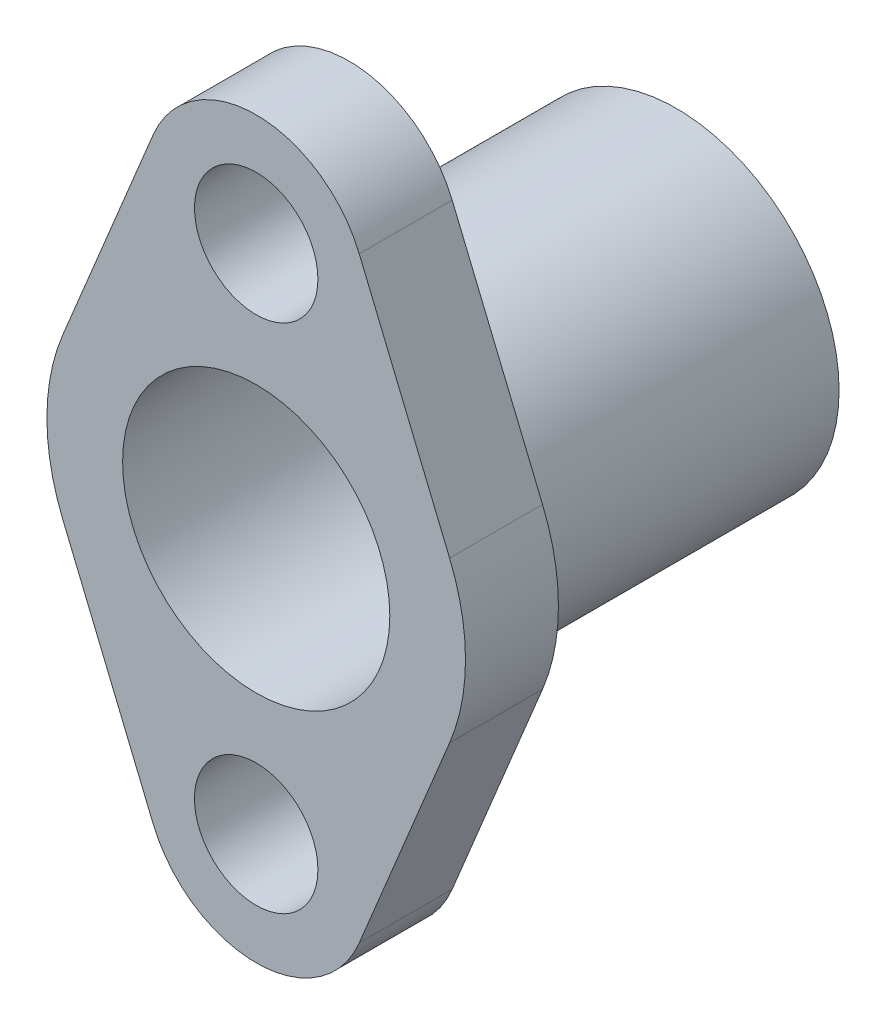
ISO-10303-21;
HEADER;
FILE_DESCRIPTION(('STEP AP214'),'2;1');
FILE_NAME('part.step','',(''),(''),'','','');
FILE_SCHEMA(('AUTOMOTIVE_DESIGN { 1 0 10303 214 1 1 1 1 }'));
ENDSEC;
DATA;
#1=APPLICATION_CONTEXT('core data for automotive mechanical design processes');
#2=APPLICATION_PROTOCOL_DEFINITION('international standard','automotive_design',2000,#1);
#3=PRODUCT_CONTEXT('',#1,'mechanical');
#4=PRODUCT('Part','Part','',(#3));
#5=PRODUCT_RELATED_PRODUCT_CATEGORY('part','',(#4));
#6=PRODUCT_DEFINITION_FORMATION('','',#4);
#7=PRODUCT_DEFINITION_CONTEXT('part definition',#1,'design');
#8=PRODUCT_DEFINITION('design','',#6,#7);
#9=PRODUCT_DEFINITION_SHAPE('','',#8);
#10=(LENGTH_UNIT() NAMED_UNIT(*) SI_UNIT(.MILLI.,.METRE.));
#11=(NAMED_UNIT(*) PLANE_ANGLE_UNIT() SI_UNIT($,.RADIAN.));
#12=(NAMED_UNIT(*) SI_UNIT($,.STERADIAN.) SOLID_ANGLE_UNIT());
#13=UNCERTAINTY_MEASURE_WITH_UNIT(LENGTH_MEASURE(1.E-05),#10,'distance_accuracy_value','');
#14=(GEOMETRIC_REPRESENTATION_CONTEXT(3) GLOBAL_UNCERTAINTY_ASSIGNED_CONTEXT((#13)) GLOBAL_UNIT_ASSIGNED_CONTEXT((#10,
#11,#12)) REPRESENTATION_CONTEXT('',''));
#15=CARTESIAN_POINT('',(0.,0.,0.));
#16=DIRECTION('',(0.,0.,1.));
#17=DIRECTION('',(1.,0.,0.));
#18=AXIS2_PLACEMENT_3D('',#15,#16,#17);
#19=CARTESIAN_POINT('',(0.,12.7,0.254000000000001));
#20=DIRECTION('',(0.,0.,1.));
#21=DIRECTION('',(1.,0.,0.));
#22=AXIS2_PLACEMENT_3D('',#19,#20,#21);
#23=PLANE('',#22);
#24=DIRECTION('',(0.382267441860465,-0.92405173171931,0.));
#25=VECTOR('',#24,1.);
#26=CARTESIAN_POINT('',(2.1209791632516,13.5774197927934,0.254000000000001));
#27=LINE('',#26,#25);
#28=CARTESIAN_POINT('',(3.52063709785057,10.1940389534884,0.254000000000001));
#29=VERTEX_POINT('',#28);
#30=CARTESIAN_POINT('',(6.60706228696624,2.73325043604651,0.254000000000001));
#31=VERTEX_POINT('',#30);
#32=EDGE_CURVE('E182',#29,#31,#27,.T.);
#33=ORIENTED_EDGE('',*,*,#32,.T.);
#34=CARTESIAN_POINT('',(0.,0.,0.254000000000001));
#35=DIRECTION('',(0.,0.,1.));
#36=DIRECTION('',(1.,0.,0.));
#37=AXIS2_PLACEMENT_3D('',#34,#35,#36);
#38=CIRCLE('',#37,7.1501);
#39=CARTESIAN_POINT('',(6.60706228696624,-2.73325043604651,0.254000000000001));
#40=VERTEX_POINT('',#39);
#41=EDGE_CURVE('E114',#31,#40,#38,.F.);
#42=ORIENTED_EDGE('',*,*,#41,.T.);
#43=DIRECTION('',(-0.382267441860465,-0.92405173171931,0.));
#44=VECTOR('',#43,1.);
#45=CARTESIAN_POINT('',(11.0931454106809,8.11091892070038,0.254000000000001));
#46=LINE('',#45,#44);
#47=CARTESIAN_POINT('',(3.52063709785057,-10.1940389534884,0.254000000000001));
#48=VERTEX_POINT('',#47);
#49=EDGE_CURVE('E117',#40,#48,#46,.T.);
#50=ORIENTED_EDGE('',*,*,#49,.T.);
#51=CARTESIAN_POINT('',(0.,-8.7376,0.254000000000001));
#52=DIRECTION('',(0.,0.,1.));
#53=DIRECTION('',(1.,0.,0.));
#54=AXIS2_PLACEMENT_3D('',#51,#52,#53);
#55=CIRCLE('',#54,3.81);
#56=CARTESIAN_POINT('',(-3.52063709785057,-10.1940389534884,0.254000000000001));
#57=VERTEX_POINT('',#56);
#58=EDGE_CURVE('E167',#48,#57,#55,.F.);
#59=ORIENTED_EDGE('',*,*,#58,.T.);
#60=DIRECTION('',(-0.382267441860465,0.92405173171931,0.));
#61=VECTOR('',#60,1.);
#62=CARTESIAN_POINT('',(-11.0931454106809,8.11091892070038,0.254000000000001));
#63=LINE('',#62,#61);
#64=CARTESIAN_POINT('',(-6.60706228696624,-2.73325043604651,0.254000000000001));
#65=VERTEX_POINT('',#64);
#66=EDGE_CURVE('E170',#57,#65,#63,.T.);
#67=ORIENTED_EDGE('',*,*,#66,.T.);
#68=CARTESIAN_POINT('',(0.,0.,0.254000000000001));
#69=DIRECTION('',(0.,0.,1.));
#70=DIRECTION('',(1.,0.,0.));
#71=AXIS2_PLACEMENT_3D('',#68,#69,#70);
#72=CIRCLE('',#71,7.1501);
#73=CARTESIAN_POINT('',(-6.60706228696624,2.73325043604651,0.254000000000001));
#74=VERTEX_POINT('',#73);
#75=EDGE_CURVE('E173',#65,#74,#72,.F.);
#76=ORIENTED_EDGE('',*,*,#75,.T.);
#77=DIRECTION('',(0.382267441860465,0.92405173171931,0.));
#78=VECTOR('',#77,1.);
#79=CARTESIAN_POINT('',(-2.12097916325161,13.5774197927934,0.254000000000001));
#80=LINE('',#79,#78);
#81=CARTESIAN_POINT('',(-3.52063709785057,10.1940389534884,0.254000000000001));
#82=VERTEX_POINT('',#81);
#83=EDGE_CURVE('E176',#74,#82,#80,.T.);
#84=ORIENTED_EDGE('',*,*,#83,.T.);
#85=CARTESIAN_POINT('',(0.,8.7376,0.254000000000001));
#86=DIRECTION('',(0.,0.,1.));
#87=DIRECTION('',(1.,0.,0.));
#88=AXIS2_PLACEMENT_3D('',#85,#86,#87);
#89=CIRCLE('',#88,3.81);
#90=EDGE_CURVE('E179',#82,#29,#89,.F.);
#91=ORIENTED_EDGE('',*,*,#90,.T.);
#92=EDGE_LOOP('',(#33,#42,#50,#59,#67,#76,#84,#91));
#93=FACE_BOUND('',#92,.T.);
#94=CARTESIAN_POINT('',(0.,8.7376,0.254000000000001));
#95=DIRECTION('',(0.,0.,1.));
#96=DIRECTION('',(1.,0.,0.));
#97=AXIS2_PLACEMENT_3D('',#94,#95,#96);
#98=CIRCLE('',#97,2.1082);
#99=CARTESIAN_POINT('',(2.1082,8.7376,0.254000000000001));
#100=VERTEX_POINT('',#99);
#101=EDGE_CURVE('E194',#100,#100,#98,.F.);
#102=ORIENTED_EDGE('',*,*,#101,.F.);
#103=EDGE_LOOP('',(#102));
#104=FACE_BOUND('',#103,.T.);
#105=CARTESIAN_POINT('',(0.,0.,0.254000000000001));
#106=DIRECTION('',(0.,0.,1.));
#107=DIRECTION('',(1.,0.,0.));
#108=AXIS2_PLACEMENT_3D('',#105,#106,#107);
#109=CIRCLE('',#108,5.5626);
#110=CARTESIAN_POINT('',(5.5626,0.,0.254000000000001));
#111=VERTEX_POINT('',#110);
#112=EDGE_CURVE('E197',#111,#111,#109,.T.);
#113=ORIENTED_EDGE('',*,*,#112,.T.);
#114=EDGE_LOOP('',(#113));
#115=FACE_BOUND('',#114,.T.);
#116=CARTESIAN_POINT('',(0.,-8.7376,0.254000000000001));
#117=DIRECTION('',(0.,0.,1.));
#118=DIRECTION('',(1.,0.,0.));
#119=AXIS2_PLACEMENT_3D('',#116,#117,#118);
#120=CIRCLE('',#119,2.1082);
#121=CARTESIAN_POINT('',(2.1082,-8.7376,0.254000000000001));
#122=VERTEX_POINT('',#121);
#123=EDGE_CURVE('E188',#122,#122,#120,.F.);
#124=ORIENTED_EDGE('',*,*,#123,.F.);
#125=EDGE_LOOP('',(#124));
#126=FACE_BOUND('',#125,.T.);
#127=ADVANCED_FACE('F47',(#93,#104,#115,#126),#23,.F.);
#128=CARTESIAN_POINT('',(0.,4.56438,3.429));
#129=DIRECTION('',(0.,0.,-1.));
#130=DIRECTION('',(-1.,0.,0.));
#131=AXIS2_PLACEMENT_3D('',#128,#129,#130);
#132=PLANE('',#131);
#133=DIRECTION('',(0.382267441860465,0.92405173171931,0.));
#134=VECTOR('',#133,1.);
#135=CARTESIAN_POINT('',(3.52063709785057,-10.1940389534884,3.429));
#136=LINE('',#135,#134);
#137=CARTESIAN_POINT('',(3.52063709785057,-10.1940389534884,3.429));
#138=VERTEX_POINT('',#137);
#139=CARTESIAN_POINT('',(6.60706228696624,-2.73325043604651,3.429));
#140=VERTEX_POINT('',#139);
#141=EDGE_CURVE('E133',#138,#140,#136,.T.);
#142=ORIENTED_EDGE('',*,*,#141,.T.);
#143=CARTESIAN_POINT('',(0.,0.,3.429));
#144=DIRECTION('',(0.,0.,1.));
#145=DIRECTION('',(1.,0.,0.));
#146=AXIS2_PLACEMENT_3D('',#143,#144,#145);
#147=CIRCLE('',#146,7.1501);
#148=CARTESIAN_POINT('',(6.60706228696624,2.73325043604651,3.429));
#149=VERTEX_POINT('',#148);
#150=EDGE_CURVE('E69',#140,#149,#147,.T.);
#151=ORIENTED_EDGE('',*,*,#150,.T.);
#152=DIRECTION('',(-0.382267441860465,0.92405173171931,0.));
#153=VECTOR('',#152,1.);
#154=CARTESIAN_POINT('',(6.60706228696624,2.73325043604651,3.429));
#155=LINE('',#154,#153);
#156=CARTESIAN_POINT('',(3.52063709785057,10.1940389534884,3.429));
#157=VERTEX_POINT('',#156);
#158=EDGE_CURVE('E121',#149,#157,#155,.T.);
#159=ORIENTED_EDGE('',*,*,#158,.T.);
#160=CARTESIAN_POINT('',(0.,8.7376,3.429));
#161=DIRECTION('',(0.,0.,1.));
#162=DIRECTION('',(1.,0.,0.));
#163=AXIS2_PLACEMENT_3D('',#160,#161,#162);
#164=CIRCLE('',#163,3.81);
#165=CARTESIAN_POINT('',(-3.52063709785057,10.1940389534884,3.429));
#166=VERTEX_POINT('',#165);
#167=EDGE_CURVE('E127',#157,#166,#164,.T.);
#168=ORIENTED_EDGE('',*,*,#167,.T.);
#169=DIRECTION('',(-0.382267441860465,-0.92405173171931,0.));
#170=VECTOR('',#169,1.);
#171=CARTESIAN_POINT('',(-3.52063709785057,10.1940389534884,3.429));
#172=LINE('',#171,#170);
#173=CARTESIAN_POINT('',(-6.60706228696624,2.73325043604651,3.429));
#174=VERTEX_POINT('',#173);
#175=EDGE_CURVE('E137',#166,#174,#172,.T.);
#176=ORIENTED_EDGE('',*,*,#175,.T.);
#177=CARTESIAN_POINT('',(0.,0.,3.429));
#178=DIRECTION('',(0.,0.,1.));
#179=DIRECTION('',(1.,0.,0.));
#180=AXIS2_PLACEMENT_3D('',#177,#178,#179);
#181=CIRCLE('',#180,7.1501);
#182=CARTESIAN_POINT('',(-6.60706228696624,-2.73325043604651,3.429));
#183=VERTEX_POINT('',#182);
#184=EDGE_CURVE('E140',#174,#183,#181,.T.);
#185=ORIENTED_EDGE('',*,*,#184,.T.);
#186=DIRECTION('',(0.382267441860465,-0.92405173171931,0.));
#187=VECTOR('',#186,1.);
#188=CARTESIAN_POINT('',(-6.60706228696624,-2.73325043604651,3.429));
#189=LINE('',#188,#187);
#190=CARTESIAN_POINT('',(-3.52063709785057,-10.1940389534884,3.429));
#191=VERTEX_POINT('',#190);
#192=EDGE_CURVE('E143',#183,#191,#189,.T.);
#193=ORIENTED_EDGE('',*,*,#192,.T.);
#194=CARTESIAN_POINT('',(0.,-8.7376,3.429));
#195=DIRECTION('',(0.,0.,1.));
#196=DIRECTION('',(1.,0.,0.));
#197=AXIS2_PLACEMENT_3D('',#194,#195,#196);
#198=CIRCLE('',#197,3.81);
#199=EDGE_CURVE('E146',#191,#138,#198,.T.);
#200=ORIENTED_EDGE('',*,*,#199,.T.);
#201=EDGE_LOOP('',(#142,#151,#159,#168,#176,#185,#193,#200));
#202=FACE_BOUND('',#201,.T.);
#203=CARTESIAN_POINT('',(0.,8.7376,3.429));
#204=DIRECTION('',(0.,0.,1.));
#205=DIRECTION('',(1.,0.,0.));
#206=AXIS2_PLACEMENT_3D('',#203,#204,#205);
#207=CIRCLE('',#206,2.1082);
#208=CARTESIAN_POINT('',(2.1082,8.7376,3.429));
#209=VERTEX_POINT('',#208);
#210=EDGE_CURVE('E191',#209,#209,#207,.T.);
#211=ORIENTED_EDGE('',*,*,#210,.F.);
#212=EDGE_LOOP('',(#211));
#213=FACE_BOUND('',#212,.T.);
#214=CARTESIAN_POINT('',(0.,0.,3.429));
#215=DIRECTION('',(0.,0.,1.));
#216=DIRECTION('',(1.,0.,0.));
#217=AXIS2_PLACEMENT_3D('',#214,#215,#216);
#218=CIRCLE('',#217,4.56438);
#219=CARTESIAN_POINT('',(4.56438,0.,3.429));
#220=VERTEX_POINT('',#219);
#221=EDGE_CURVE('E14',#220,#220,#218,.T.);
#222=ORIENTED_EDGE('',*,*,#221,.F.);
#223=EDGE_LOOP('',(#222));
#224=FACE_BOUND('',#223,.T.);
#225=CARTESIAN_POINT('',(0.,-8.7376,3.429));
#226=DIRECTION('',(0.,0.,1.));
#227=DIRECTION('',(1.,0.,0.));
#228=AXIS2_PLACEMENT_3D('',#225,#226,#227);
#229=CIRCLE('',#228,2.1082);
#230=CARTESIAN_POINT('',(2.1082,-8.7376,3.429));
#231=VERTEX_POINT('',#230);
#232=EDGE_CURVE('E185',#231,#231,#229,.T.);
#233=ORIENTED_EDGE('',*,*,#232,.F.);
#234=EDGE_LOOP('',(#233));
#235=FACE_BOUND('',#234,.T.);
#236=ADVANCED_FACE('F130',(#202,#213,#224,#235),#132,.F.);
#237=CARTESIAN_POINT('',(0.,0.,-8.4718061233274));
#238=DIRECTION('',(0.,0.,1.));
#239=DIRECTION('',(1.,0.,0.));
#240=AXIS2_PLACEMENT_3D('',#237,#238,#239);
#241=CYLINDRICAL_SURFACE('',#240,4.56438);
#242=CARTESIAN_POINT('',(0.,0.,-9.72415775921604));
#243=DIRECTION('',(0.,0.,1.));
#244=DIRECTION('',(1.,0.,0.));
#245=AXIS2_PLACEMENT_3D('',#242,#243,#244);
#246=CIRCLE('',#245,4.56438);
#247=CARTESIAN_POINT('',(4.56438,0.,-9.72415775921604));
#248=VERTEX_POINT('',#247);
#249=EDGE_CURVE('E54',#248,#248,#246,.T.);
#250=ORIENTED_EDGE('',*,*,#249,.F.);
#251=EDGE_LOOP('',(#250));
#252=FACE_BOUND('',#251,.T.);
#253=ORIENTED_EDGE('',*,*,#221,.T.);
#254=EDGE_LOOP('',(#253));
#255=FACE_BOUND('',#254,.T.);
#256=ADVANCED_FACE('F213',(#252,#255),#241,.F.);
#257=CARTESIAN_POINT('',(0.,0.,-9.72415775921604));
#258=DIRECTION('',(0.,0.,1.));
#259=DIRECTION('',(1.,0.,0.));
#260=AXIS2_PLACEMENT_3D('',#257,#258,#259);
#261=CONICAL_SURFACE('',#260,4.56438,1.0471975511966);
#262=CARTESIAN_POINT('',(0.,0.,-9.906));
#263=DIRECTION('',(0.,0.,1.));
#264=DIRECTION('',(1.,0.,0.));
#265=AXIS2_PLACEMENT_3D('',#262,#263,#264);
#266=CIRCLE('',#265,4.24942);
#267=CARTESIAN_POINT('',(4.24942,0.,-9.906));
#268=VERTEX_POINT('',#267);
#269=EDGE_CURVE('E206',#268,#268,#266,.T.);
#270=ORIENTED_EDGE('',*,*,#269,.F.);
#271=EDGE_LOOP('',(#270));
#272=FACE_BOUND('',#271,.T.);
#273=ORIENTED_EDGE('',*,*,#249,.T.);
#274=EDGE_LOOP('',(#273));
#275=FACE_BOUND('',#274,.T.);
#276=ADVANCED_FACE('F211',(#272,#275),#261,.F.);
#277=CARTESIAN_POINT('',(0.,0.,-8.4718061233274));
#278=DIRECTION('',(0.,0.,1.));
#279=DIRECTION('',(1.,0.,0.));
#280=AXIS2_PLACEMENT_3D('',#277,#278,#279);
#281=CYLINDRICAL_SURFACE('',#280,4.24942);
#282=CARTESIAN_POINT('',(0.,0.,-10.922));
#283=DIRECTION('',(0.,0.,1.));
#284=DIRECTION('',(1.,0.,0.));
#285=AXIS2_PLACEMENT_3D('',#282,#283,#284);
#286=CIRCLE('',#285,4.24942);
#287=CARTESIAN_POINT('',(4.24942,0.,-10.922));
#288=VERTEX_POINT('',#287);
#289=EDGE_CURVE('E203',#288,#288,#286,.T.);
#290=ORIENTED_EDGE('',*,*,#289,.F.);
#291=EDGE_LOOP('',(#290));
#292=FACE_BOUND('',#291,.T.);
#293=ORIENTED_EDGE('',*,*,#269,.T.);
#294=EDGE_LOOP('',(#293));
#295=FACE_BOUND('',#294,.T.);
#296=ADVANCED_FACE('F248',(#292,#295),#281,.F.);
#297=CARTESIAN_POINT('',(0.,5.5626,-10.922));
#298=DIRECTION('',(0.,0.,1.));
#299=DIRECTION('',(1.,0.,0.));
#300=AXIS2_PLACEMENT_3D('',#297,#298,#299);
#301=PLANE('',#300);
#302=CARTESIAN_POINT('',(0.,0.,-10.922));
#303=DIRECTION('',(0.,0.,1.));
#304=DIRECTION('',(1.,0.,0.));
#305=AXIS2_PLACEMENT_3D('',#302,#303,#304);
#306=CIRCLE('',#305,5.5626);
#307=CARTESIAN_POINT('',(5.5626,0.,-10.922));
#308=VERTEX_POINT('',#307);
#309=EDGE_CURVE('E200',#308,#308,#306,.T.);
#310=ORIENTED_EDGE('',*,*,#309,.F.);
#311=EDGE_LOOP('',(#310));
#312=FACE_BOUND('',#311,.T.);
#313=ORIENTED_EDGE('',*,*,#289,.T.);
#314=EDGE_LOOP('',(#313));
#315=FACE_BOUND('',#314,.T.);
#316=ADVANCED_FACE('F242',(#312,#315),#301,.F.);
#317=CARTESIAN_POINT('',(0.,0.,-8.4718061233274));
#318=DIRECTION('',(0.,0.,1.));
#319=DIRECTION('',(1.,0.,0.));
#320=AXIS2_PLACEMENT_3D('',#317,#318,#319);
#321=CYLINDRICAL_SURFACE('',#320,5.5626);
#322=ORIENTED_EDGE('',*,*,#112,.F.);
#323=EDGE_LOOP('',(#322));
#324=FACE_BOUND('',#323,.T.);
#325=ORIENTED_EDGE('',*,*,#309,.T.);
#326=EDGE_LOOP('',(#325));
#327=FACE_BOUND('',#326,.T.);
#328=ADVANCED_FACE('F239',(#324,#327),#321,.T.);
#329=CARTESIAN_POINT('',(0.,8.7376,3.429));
#330=DIRECTION('',(0.,0.,-1.));
#331=DIRECTION('',(-1.,0.,0.));
#332=AXIS2_PLACEMENT_3D('',#329,#330,#331);
#333=CYLINDRICAL_SURFACE('',#332,2.1082);
#334=ORIENTED_EDGE('',*,*,#210,.T.);
#335=EDGE_LOOP('',(#334));
#336=FACE_BOUND('',#335,.T.);
#337=ORIENTED_EDGE('',*,*,#101,.T.);
#338=EDGE_LOOP('',(#337));
#339=FACE_BOUND('',#338,.T.);
#340=ADVANCED_FACE('F226',(#336,#339),#333,.F.);
#341=CARTESIAN_POINT('',(0.,-8.7376,3.429));
#342=DIRECTION('',(0.,0.,-1.));
#343=DIRECTION('',(-1.,0.,0.));
#344=AXIS2_PLACEMENT_3D('',#341,#342,#343);
#345=CYLINDRICAL_SURFACE('',#344,2.1082);
#346=ORIENTED_EDGE('',*,*,#232,.T.);
#347=EDGE_LOOP('',(#346));
#348=FACE_BOUND('',#347,.T.);
#349=ORIENTED_EDGE('',*,*,#123,.T.);
#350=EDGE_LOOP('',(#349));
#351=FACE_BOUND('',#350,.T.);
#352=ADVANCED_FACE('F223',(#348,#351),#345,.F.);
#353=CARTESIAN_POINT('',(0.,0.,3.429));
#354=DIRECTION('',(0.,0.,-1.));
#355=DIRECTION('',(-1.,0.,0.));
#356=AXIS2_PLACEMENT_3D('',#353,#354,#355);
#357=CYLINDRICAL_SURFACE('',#356,7.1501);
#358=DIRECTION('',(0.,0.,-1.));
#359=VECTOR('',#358,1.);
#360=CARTESIAN_POINT('',(6.60706228696624,2.73325043604651,3.429));
#361=LINE('',#360,#359);
#362=EDGE_CURVE('E110',#149,#31,#361,.T.);
#363=ORIENTED_EDGE('',*,*,#362,.F.);
#364=ORIENTED_EDGE('',*,*,#150,.F.);
#365=DIRECTION('',(0.,0.,-1.));
#366=VECTOR('',#365,1.);
#367=CARTESIAN_POINT('',(6.60706228696624,-2.73325043604651,3.429));
#368=LINE('',#367,#366);
#369=EDGE_CURVE('E149',#140,#40,#368,.T.);
#370=ORIENTED_EDGE('',*,*,#369,.T.);
#371=ORIENTED_EDGE('',*,*,#41,.F.);
#372=EDGE_LOOP('',(#363,#364,#370,#371));
#373=FACE_BOUND('',#372,.T.);
#374=ADVANCED_FACE('F112',(#373),#357,.T.);
#375=CARTESIAN_POINT('',(6.60706228696624,2.73325043604651,3.429));
#376=DIRECTION('',(-0.92405173171931,-0.382267441860465,0.));
#377=DIRECTION('',(0.382267441860465,-0.92405173171931,0.));
#378=AXIS2_PLACEMENT_3D('',#375,#376,#377);
#379=PLANE('',#378);
#380=DIRECTION('',(0.,0.,-1.));
#381=VECTOR('',#380,1.);
#382=CARTESIAN_POINT('',(3.52063709785057,10.1940389534884,3.429));
#383=LINE('',#382,#381);
#384=EDGE_CURVE('E118',#157,#29,#383,.T.);
#385=ORIENTED_EDGE('',*,*,#384,.F.);
#386=ORIENTED_EDGE('',*,*,#158,.F.);
#387=ORIENTED_EDGE('',*,*,#362,.T.);
#388=ORIENTED_EDGE('',*,*,#32,.F.);
#389=EDGE_LOOP('',(#385,#386,#387,#388));
#390=FACE_BOUND('',#389,.T.);
#391=ADVANCED_FACE('F122',(#390),#379,.F.);
#392=CARTESIAN_POINT('',(0.,8.7376,3.429));
#393=DIRECTION('',(0.,0.,-1.));
#394=DIRECTION('',(-1.,0.,0.));
#395=AXIS2_PLACEMENT_3D('',#392,#393,#394);
#396=CYLINDRICAL_SURFACE('',#395,3.81);
#397=DIRECTION('',(0.,0.,-1.));
#398=VECTOR('',#397,1.);
#399=CARTESIAN_POINT('',(-3.52063709785057,10.1940389534884,3.429));
#400=LINE('',#399,#398);
#401=EDGE_CURVE('E161',#166,#82,#400,.T.);
#402=ORIENTED_EDGE('',*,*,#401,.F.);
#403=ORIENTED_EDGE('',*,*,#167,.F.);
#404=ORIENTED_EDGE('',*,*,#384,.T.);
#405=ORIENTED_EDGE('',*,*,#90,.F.);
#406=EDGE_LOOP('',(#402,#403,#404,#405));
#407=FACE_BOUND('',#406,.T.);
#408=ADVANCED_FACE('F269',(#407),#396,.T.);
#409=CARTESIAN_POINT('',(-3.52063709785057,10.1940389534884,3.429));
#410=DIRECTION('',(0.92405173171931,-0.382267441860465,0.));
#411=DIRECTION('',(0.382267441860465,0.92405173171931,0.));
#412=AXIS2_PLACEMENT_3D('',#409,#410,#411);
#413=PLANE('',#412);
#414=DIRECTION('',(0.,0.,-1.));
#415=VECTOR('',#414,1.);
#416=CARTESIAN_POINT('',(-6.60706228696624,2.73325043604651,3.429));
#417=LINE('',#416,#415);
#418=EDGE_CURVE('E158',#174,#74,#417,.T.);
#419=ORIENTED_EDGE('',*,*,#418,.F.);
#420=ORIENTED_EDGE('',*,*,#175,.F.);
#421=ORIENTED_EDGE('',*,*,#401,.T.);
#422=ORIENTED_EDGE('',*,*,#83,.F.);
#423=EDGE_LOOP('',(#419,#420,#421,#422));
#424=FACE_BOUND('',#423,.T.);
#425=ADVANCED_FACE('F272',(#424),#413,.F.);
#426=CARTESIAN_POINT('',(0.,0.,3.429));
#427=DIRECTION('',(0.,0.,-1.));
#428=DIRECTION('',(-1.,0.,0.));
#429=AXIS2_PLACEMENT_3D('',#426,#427,#428);
#430=CYLINDRICAL_SURFACE('',#429,7.1501);
#431=DIRECTION('',(0.,0.,-1.));
#432=VECTOR('',#431,1.);
#433=CARTESIAN_POINT('',(-6.60706228696624,-2.73325043604651,3.429));
#434=LINE('',#433,#432);
#435=EDGE_CURVE('E155',#183,#65,#434,.T.);
#436=ORIENTED_EDGE('',*,*,#435,.F.);
#437=ORIENTED_EDGE('',*,*,#184,.F.);
#438=ORIENTED_EDGE('',*,*,#418,.T.);
#439=ORIENTED_EDGE('',*,*,#75,.F.);
#440=EDGE_LOOP('',(#436,#437,#438,#439));
#441=FACE_BOUND('',#440,.T.);
#442=ADVANCED_FACE('F276',(#441),#430,.T.);
#443=CARTESIAN_POINT('',(-6.60706228696624,-2.73325043604651,3.429));
#444=DIRECTION('',(0.92405173171931,0.382267441860465,0.));
#445=DIRECTION('',(-0.382267441860465,0.92405173171931,0.));
#446=AXIS2_PLACEMENT_3D('',#443,#444,#445);
#447=PLANE('',#446);
#448=DIRECTION('',(0.,0.,-1.));
#449=VECTOR('',#448,1.);
#450=CARTESIAN_POINT('',(-3.52063709785057,-10.1940389534884,3.429));
#451=LINE('',#450,#449);
#452=EDGE_CURVE('E152',#191,#57,#451,.T.);
#453=ORIENTED_EDGE('',*,*,#452,.F.);
#454=ORIENTED_EDGE('',*,*,#192,.F.);
#455=ORIENTED_EDGE('',*,*,#435,.T.);
#456=ORIENTED_EDGE('',*,*,#66,.F.);
#457=EDGE_LOOP('',(#453,#454,#455,#456));
#458=FACE_BOUND('',#457,.T.);
#459=ADVANCED_FACE('F280',(#458),#447,.F.);
#460=CARTESIAN_POINT('',(0.,-8.7376,3.429));
#461=DIRECTION('',(0.,0.,-1.));
#462=DIRECTION('',(-1.,0.,0.));
#463=AXIS2_PLACEMENT_3D('',#460,#461,#462);
#464=CYLINDRICAL_SURFACE('',#463,3.81);
#465=DIRECTION('',(0.,0.,-1.));
#466=VECTOR('',#465,1.);
#467=CARTESIAN_POINT('',(3.52063709785057,-10.1940389534884,3.429));
#468=LINE('',#467,#466);
#469=EDGE_CURVE('E61',#138,#48,#468,.T.);
#470=ORIENTED_EDGE('',*,*,#469,.F.);
#471=ORIENTED_EDGE('',*,*,#199,.F.);
#472=ORIENTED_EDGE('',*,*,#452,.T.);
#473=ORIENTED_EDGE('',*,*,#58,.F.);
#474=EDGE_LOOP('',(#470,#471,#472,#473));
#475=FACE_BOUND('',#474,.T.);
#476=ADVANCED_FACE('F284',(#475),#464,.T.);
#477=CARTESIAN_POINT('',(3.52063709785057,-10.1940389534884,3.429));
#478=DIRECTION('',(-0.92405173171931,0.382267441860465,0.));
#479=DIRECTION('',(-0.382267441860465,-0.92405173171931,0.));
#480=AXIS2_PLACEMENT_3D('',#477,#478,#479);
#481=PLANE('',#480);
#482=ORIENTED_EDGE('',*,*,#369,.F.);
#483=ORIENTED_EDGE('',*,*,#141,.F.);
#484=ORIENTED_EDGE('',*,*,#469,.T.);
#485=ORIENTED_EDGE('',*,*,#49,.F.);
#486=EDGE_LOOP('',(#482,#483,#484,#485));
#487=FACE_BOUND('',#486,.T.);
#488=ADVANCED_FACE('F288',(#487),#481,.F.);
#489=CLOSED_SHELL('',(#127,#236,#256,#276,#296,#316,#328,#340,#352,#374,#391,#408,#425,#442,
#459,#476,#488));
#490=MANIFOLD_SOLID_BREP('B2',#489);
#491=ADVANCED_BREP_SHAPE_REPRESENTATION('',(#18,#490),#14);
#492=SHAPE_DEFINITION_REPRESENTATION(#9,#491);
ENDSEC;
END-ISO-10303-21;
